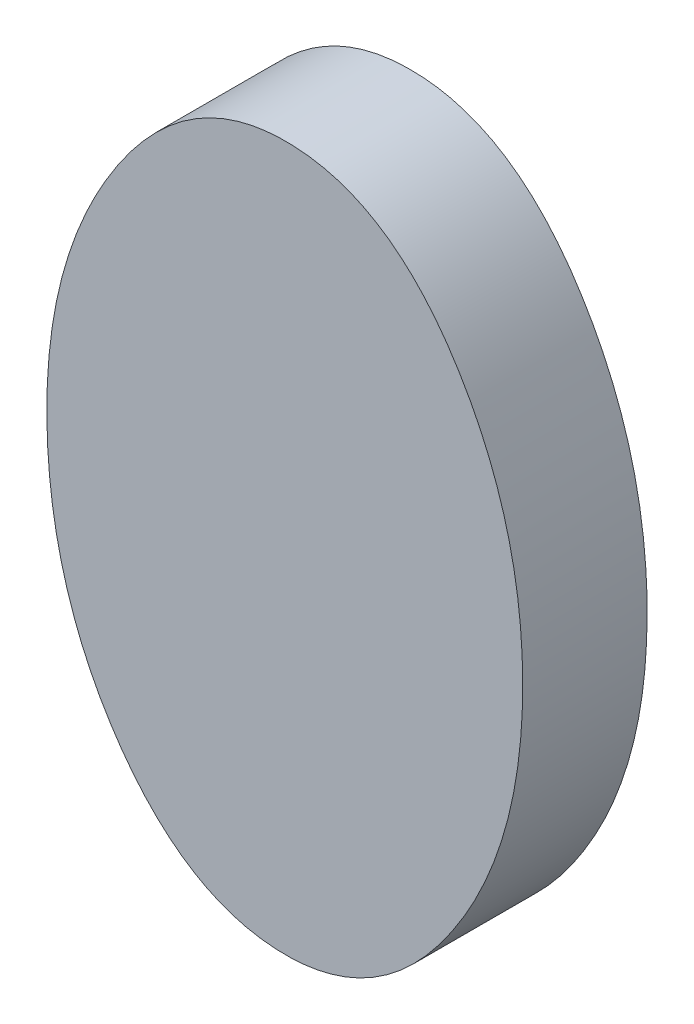
ISO-10303-21;
HEADER;
FILE_DESCRIPTION(('STEP AP214'),'2;1');
FILE_NAME('part.step','',(''),(''),'','','');
FILE_SCHEMA(('AUTOMOTIVE_DESIGN { 1 0 10303 214 1 1 1 1 }'));
ENDSEC;
DATA;
#1=APPLICATION_CONTEXT('core data for automotive mechanical design processes');
#2=APPLICATION_PROTOCOL_DEFINITION('international standard','automotive_design',2000,#1);
#3=PRODUCT_CONTEXT('',#1,'mechanical');
#4=PRODUCT('Part','Part','',(#3));
#5=PRODUCT_RELATED_PRODUCT_CATEGORY('part','',(#4));
#6=PRODUCT_DEFINITION_FORMATION('','',#4);
#7=PRODUCT_DEFINITION_CONTEXT('part definition',#1,'design');
#8=PRODUCT_DEFINITION('design','',#6,#7);
#9=PRODUCT_DEFINITION_SHAPE('','',#8);
#10=(LENGTH_UNIT() NAMED_UNIT(*) SI_UNIT(.MILLI.,.METRE.));
#11=(NAMED_UNIT(*) PLANE_ANGLE_UNIT() SI_UNIT($,.RADIAN.));
#12=(NAMED_UNIT(*) SI_UNIT($,.STERADIAN.) SOLID_ANGLE_UNIT());
#13=UNCERTAINTY_MEASURE_WITH_UNIT(LENGTH_MEASURE(1.E-05),#10,'distance_accuracy_value','');
#14=(GEOMETRIC_REPRESENTATION_CONTEXT(3) GLOBAL_UNCERTAINTY_ASSIGNED_CONTEXT((#13)) GLOBAL_UNIT_ASSIGNED_CONTEXT((#10,
#11,#12)) REPRESENTATION_CONTEXT('',''));
#15=CARTESIAN_POINT('',(0.,0.,0.));
#16=DIRECTION('',(0.,0.,1.));
#17=DIRECTION('',(1.,0.,0.));
#18=AXIS2_PLACEMENT_3D('',#15,#16,#17);
#19=CARTESIAN_POINT('',(-8.95983005625009,-22.770458436575,135.210489149433));
#20=DIRECTION('',(0.,0.,-1.));
#21=DIRECTION('',(0.,-1.,0.));
#22=AXIS2_PLACEMENT_3D('',#19,#20,#21);
#23=PLANE('',#22);
#24=CARTESIAN_POINT('',(-6.23796388874143,-65.57003935891,135.210489149433));
#25=CARTESIAN_POINT('',(-6.23796388874143,-65.3454298885426,135.210489149433));
#26=CARTESIAN_POINT('',(-6.29248894750601,-65.1476760236845,135.210489149433));
#27=CARTESIAN_POINT('',(-6.51058733234495,-64.8058791549763,135.210489149433));
#28=CARTESIAN_POINT('',(-6.64649278888791,-64.72042998391,135.210489149433));
#29=CARTESIAN_POINT('',(-6.96875841388791,-64.72042998391,135.210489149433));
#30=CARTESIAN_POINT('',(-7.10466304183794,-64.80587919812,135.210489149433));
#31=CARTESIAN_POINT('',(-7.32927248249143,-65.1476759822926,135.210489149433));
#32=CARTESIAN_POINT('',(-7.38542482624143,-65.3454298885426,135.210489149433));
#33=CARTESIAN_POINT('',(-7.38542482624143,-65.80441435891,135.210489149433));
#34=CARTESIAN_POINT('',(-7.32927261527016,-66.0046096658635,135.210489149433));
#35=CARTESIAN_POINT('',(-7.10466310749143,-66.3366407306752,135.210489149433));
#36=CARTESIAN_POINT('',(-6.96875841388791,-66.41964873391,135.210489149433));
#37=CARTESIAN_POINT('',(-6.65300295124143,-66.41964873391,135.210489149433));
#38=CARTESIAN_POINT('',(-6.51872564050324,-66.3354201962772,135.210489149433));
#39=CARTESIAN_POINT('',(-6.29411623249143,-65.998506155785,135.210489149433));
#40=CARTESIAN_POINT('',(-6.23796388874143,-65.7995314510426,135.210489149433));
#41=CARTESIAN_POINT('',(-6.23796388874143,-65.57003935891,135.210489149433));
#42=(BOUNDED_CURVE() B_SPLINE_CURVE(3,(#24,#25,#26,#27,#28,#29,#30,#31,#32,#33,#34,#35,#36,#37,
#38,#39,#40,#41),.UNSPECIFIED.,.T.,.F.) B_SPLINE_CURVE_WITH_KNOTS((4,2,2,2,2,2,2,2,4),(0.,
0.124864100024788,0.249728274325215,0.372095551438777,0.494462757016289,0.622150221664653,
0.749837535347291,0.874918786057372,1.),
.UNSPECIFIED.) CURVE() GEOMETRIC_REPRESENTATION_ITEM() RATIONAL_B_SPLINE_CURVE((1.,1.,1.,1.,1.,
1.,1.,1.,1.,1.,1.,1.,1.,1.,1.,1.,1.,1.)) REPRESENTATION_ITEM(''));
#43=CARTESIAN_POINT('',(-6.23796388874143,-65.57003935891,135.210489149433));
#44=VERTEX_POINT('',#43);
#45=EDGE_CURVE('E11',#44,#44,#42,.T.);
#46=ORIENTED_EDGE('',*,*,#45,.T.);
#47=EDGE_LOOP('',(#46));
#48=FACE_BOUND('',#47,.T.);
#49=ADVANCED_FACE('F42',(#48),#23,.F.);
#50=CARTESIAN_POINT('',(-6.23796388874143,-65.57003935891,135.410489149433));
#51=CARTESIAN_POINT('',(-6.23796388874143,-65.3454298885426,135.410489149433));
#52=CARTESIAN_POINT('',(-6.29248894750601,-65.1476760236845,135.410489149433));
#53=CARTESIAN_POINT('',(-6.51058733234495,-64.8058791549763,135.410489149433));
#54=CARTESIAN_POINT('',(-6.64649278888791,-64.72042998391,135.410489149433));
#55=CARTESIAN_POINT('',(-6.96875841388791,-64.72042998391,135.410489149433));
#56=CARTESIAN_POINT('',(-7.10466304183794,-64.80587919812,135.410489149433));
#57=CARTESIAN_POINT('',(-7.32927248249143,-65.1476759822926,135.410489149433));
#58=CARTESIAN_POINT('',(-7.38542482624143,-65.3454298885426,135.410489149433));
#59=CARTESIAN_POINT('',(-7.38542482624143,-65.80441435891,135.410489149433));
#60=CARTESIAN_POINT('',(-7.32927261527016,-66.0046096658635,135.410489149433));
#61=CARTESIAN_POINT('',(-7.10466310749143,-66.3366407306752,135.410489149433));
#62=CARTESIAN_POINT('',(-6.96875841388791,-66.41964873391,135.410489149433));
#63=CARTESIAN_POINT('',(-6.65300295124143,-66.41964873391,135.410489149433));
#64=CARTESIAN_POINT('',(-6.51872564050324,-66.3354201962772,135.410489149433));
#65=CARTESIAN_POINT('',(-6.29411623249143,-65.998506155785,135.410489149433));
#66=CARTESIAN_POINT('',(-6.23796388874143,-65.7995314510426,135.410489149433));
#67=CARTESIAN_POINT('',(-6.23796388874143,-65.57003935891,135.410489149433));
#68=(BOUNDED_CURVE() B_SPLINE_CURVE(3,(#50,#51,#52,#53,#54,#55,#56,#57,#58,#59,#60,#61,#62,#63,
#64,#65,#66,#67),.UNSPECIFIED.,.T.,.F.) B_SPLINE_CURVE_WITH_KNOTS((4,2,2,2,2,2,2,2,4),(0.,
0.124864100024788,0.249728274325215,0.372095551438777,0.494462757016289,0.622150221664653,
0.749837535347291,0.874918786057372,1.),
.UNSPECIFIED.) CURVE() GEOMETRIC_REPRESENTATION_ITEM() RATIONAL_B_SPLINE_CURVE((1.,1.,1.,1.,1.,
1.,1.,1.,1.,1.,1.,1.,1.,1.,1.,1.,1.,1.)) REPRESENTATION_ITEM(''));
#69=DIRECTION('',(0.,0.,-1.));
#70=VECTOR('',#69,1.);
#71=SURFACE_OF_LINEAR_EXTRUSION('',#68,#70);
#72=ORIENTED_EDGE('',*,*,#45,.F.);
#73=EDGE_LOOP('',(#72));
#74=FACE_BOUND('',#73,.T.);
#75=CARTESIAN_POINT('',(-6.23796388874143,-65.57003935891,134.910489149433));
#76=CARTESIAN_POINT('',(-6.23796388874143,-65.7995314510426,134.910489149433));
#77=CARTESIAN_POINT('',(-6.29411623249143,-65.998506155785,134.910489149433));
#78=CARTESIAN_POINT('',(-6.51872564050324,-66.3354201962772,134.910489149433));
#79=CARTESIAN_POINT('',(-6.65300295124143,-66.41964873391,134.910489149433));
#80=CARTESIAN_POINT('',(-6.96875841388791,-66.41964873391,134.910489149433));
#81=CARTESIAN_POINT('',(-7.10466310749143,-66.3366407306752,134.910489149433));
#82=CARTESIAN_POINT('',(-7.32927261527016,-66.0046096658635,134.910489149433));
#83=CARTESIAN_POINT('',(-7.38542482624143,-65.80441435891,134.910489149433));
#84=CARTESIAN_POINT('',(-7.38542482624143,-65.3454298885426,134.910489149433));
#85=CARTESIAN_POINT('',(-7.32927248249143,-65.1476759822926,134.910489149433));
#86=CARTESIAN_POINT('',(-7.10466304183794,-64.80587919812,134.910489149433));
#87=CARTESIAN_POINT('',(-6.96875841388791,-64.72042998391,134.910489149433));
#88=CARTESIAN_POINT('',(-6.64649278888791,-64.72042998391,134.910489149433));
#89=CARTESIAN_POINT('',(-6.51058733234495,-64.8058791549763,134.910489149433));
#90=CARTESIAN_POINT('',(-6.29248894750601,-65.1476760236845,134.910489149433));
#91=CARTESIAN_POINT('',(-6.23796388874143,-65.3454298885426,134.910489149433));
#92=CARTESIAN_POINT('',(-6.23796388874143,-65.57003935891,134.910489149433));
#93=(BOUNDED_CURVE() B_SPLINE_CURVE(3,(#75,#76,#77,#78,#79,#80,#81,#82,#83,#84,#85,#86,#87,#88,
#89,#90,#91,#92),.UNSPECIFIED.,.T.,.F.) B_SPLINE_CURVE_WITH_KNOTS((4,2,2,2,2,2,2,2,4),(0.,
0.125081213942628,0.250162464652709,0.377849778335347,0.505537242983711,0.627904448561223,
0.750271725674785,0.875135899975212,1.),
.UNSPECIFIED.) CURVE() GEOMETRIC_REPRESENTATION_ITEM() RATIONAL_B_SPLINE_CURVE((1.,1.,1.,1.,1.,
1.,1.,1.,1.,1.,1.,1.,1.,1.,1.,1.,1.,1.)) REPRESENTATION_ITEM(''));
#94=CARTESIAN_POINT('',(-6.23796388874143,-65.57003935891,134.910489149433));
#95=VERTEX_POINT('',#94);
#96=EDGE_CURVE('E52',#95,#95,#93,.T.);
#97=ORIENTED_EDGE('',*,*,#96,.F.);
#98=EDGE_LOOP('',(#97));
#99=FACE_BOUND('',#98,.T.);
#100=ADVANCED_FACE('F81',(#74,#99),#71,.F.);
#101=CARTESIAN_POINT('',(-7.38510803089315,-65.6003379610564,134.910489149433));
#102=DIRECTION('',(0.,0.,1.));
#103=DIRECTION('',(1.,0.,0.));
#104=AXIS2_PLACEMENT_3D('',#101,#102,#103);
#105=PLANE('',#104);
#106=ORIENTED_EDGE('',*,*,#96,.T.);
#107=EDGE_LOOP('',(#106));
#108=FACE_BOUND('',#107,.T.);
#109=ADVANCED_FACE('F65',(#108),#105,.F.);
#110=CLOSED_SHELL('',(#49,#100,#109));
#111=MANIFOLD_SOLID_BREP('B2',#110);
#112=ADVANCED_BREP_SHAPE_REPRESENTATION('',(#18,#111),#14);
#113=SHAPE_DEFINITION_REPRESENTATION(#9,#112);
ENDSEC;
END-ISO-10303-21;
